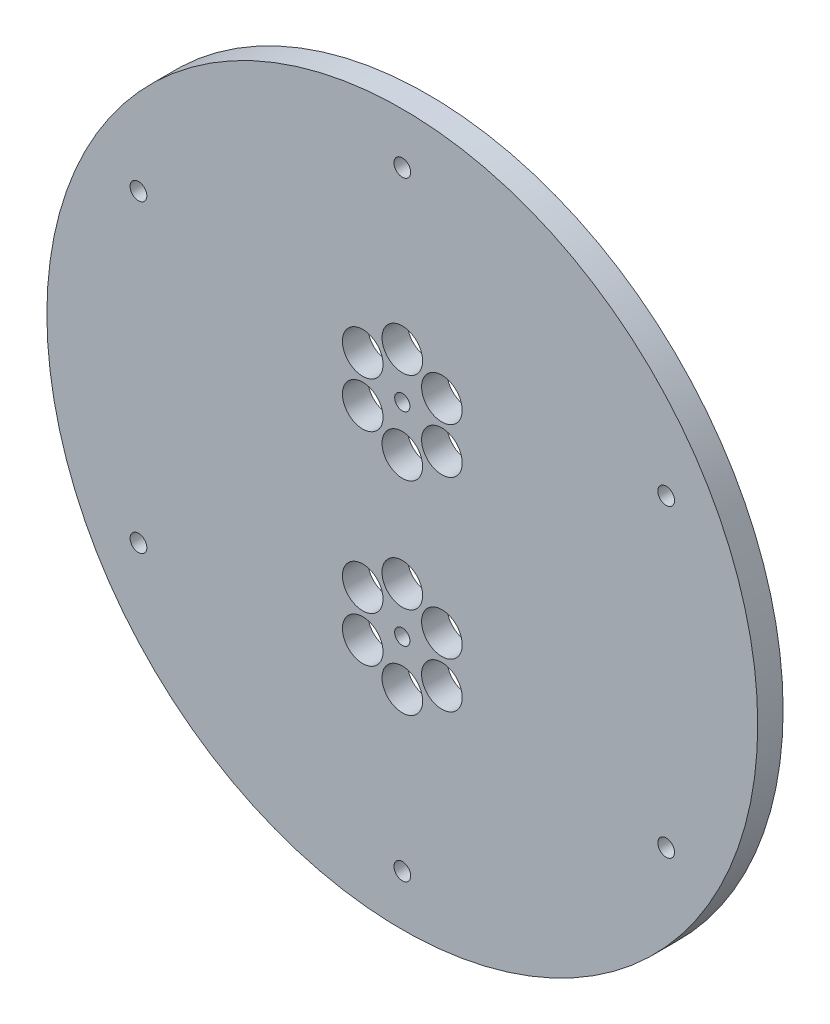
ISO-10303-21;
HEADER;
FILE_DESCRIPTION(('STEP AP214'),'2;1');
FILE_NAME('part.step','',(''),(''),'','','');
FILE_SCHEMA(('AUTOMOTIVE_DESIGN { 1 0 10303 214 1 1 1 1 }'));
ENDSEC;
DATA;
#1=APPLICATION_CONTEXT('core data for automotive mechanical design processes');
#2=APPLICATION_PROTOCOL_DEFINITION('international standard','automotive_design',2000,#1);
#3=PRODUCT_CONTEXT('',#1,'mechanical');
#4=PRODUCT('Part','Part','',(#3));
#5=PRODUCT_RELATED_PRODUCT_CATEGORY('part','',(#4));
#6=PRODUCT_DEFINITION_FORMATION('','',#4);
#7=PRODUCT_DEFINITION_CONTEXT('part definition',#1,'design');
#8=PRODUCT_DEFINITION('design','',#6,#7);
#9=PRODUCT_DEFINITION_SHAPE('','',#8);
#10=(LENGTH_UNIT() NAMED_UNIT(*) SI_UNIT(.MILLI.,.METRE.));
#11=(NAMED_UNIT(*) PLANE_ANGLE_UNIT() SI_UNIT($,.RADIAN.));
#12=(NAMED_UNIT(*) SI_UNIT($,.STERADIAN.) SOLID_ANGLE_UNIT());
#13=UNCERTAINTY_MEASURE_WITH_UNIT(LENGTH_MEASURE(1.E-05),#10,'distance_accuracy_value','');
#14=(GEOMETRIC_REPRESENTATION_CONTEXT(3) GLOBAL_UNCERTAINTY_ASSIGNED_CONTEXT((#13)) GLOBAL_UNIT_ASSIGNED_CONTEXT((#10,
#11,#12)) REPRESENTATION_CONTEXT('',''));
#15=CARTESIAN_POINT('',(0.,0.,0.));
#16=DIRECTION('',(0.,0.,1.));
#17=DIRECTION('',(1.,0.,0.));
#18=AXIS2_PLACEMENT_3D('',#15,#16,#17);
#19=CARTESIAN_POINT('',(0.,0.,5.));
#20=DIRECTION('',(0.,0.,1.));
#21=DIRECTION('',(1.,0.,0.));
#22=AXIS2_PLACEMENT_3D('',#19,#20,#21);
#23=PLANE('',#22);
#24=CARTESIAN_POINT('',(0.,-29.,5.));
#25=DIRECTION('',(0.,0.,1.));
#26=DIRECTION('',(-1.,0.,0.));
#27=AXIS2_PLACEMENT_3D('',#24,#25,#26);
#28=CIRCLE('',#27,4.);
#29=CARTESIAN_POINT('',(-4.,-29.,5.));
#30=VERTEX_POINT('',#29);
#31=EDGE_CURVE('E104',#30,#30,#28,.T.);
#32=ORIENTED_EDGE('',*,*,#31,.F.);
#33=EDGE_LOOP('',(#32));
#34=FACE_BOUND('',#33,.T.);
#35=CARTESIAN_POINT('',(0.,-20.,5.));
#36=DIRECTION('',(0.,0.,1.));
#37=DIRECTION('',(-1.,0.,0.));
#38=AXIS2_PLACEMENT_3D('',#35,#36,#37);
#39=CIRCLE('',#38,1.5);
#40=CARTESIAN_POINT('',(-1.5,-20.,5.));
#41=VERTEX_POINT('',#40);
#42=EDGE_CURVE('E108',#41,#41,#39,.T.);
#43=ORIENTED_EDGE('',*,*,#42,.F.);
#44=EDGE_LOOP('',(#43));
#45=FACE_BOUND('',#44,.T.);
#46=CARTESIAN_POINT('',(0.,-11.,5.));
#47=DIRECTION('',(0.,0.,1.));
#48=DIRECTION('',(-1.,0.,0.));
#49=AXIS2_PLACEMENT_3D('',#46,#47,#48);
#50=CIRCLE('',#49,4.);
#51=CARTESIAN_POINT('',(-3.99999999999999,-11.,5.));
#52=VERTEX_POINT('',#51);
#53=EDGE_CURVE('E112',#52,#52,#50,.T.);
#54=ORIENTED_EDGE('',*,*,#53,.F.);
#55=EDGE_LOOP('',(#54));
#56=FACE_BOUND('',#55,.T.);
#57=CARTESIAN_POINT('',(-7.79422863405994,24.5,5.));
#58=DIRECTION('',(0.,0.,1.));
#59=DIRECTION('',(1.,0.,0.));
#60=AXIS2_PLACEMENT_3D('',#57,#58,#59);
#61=CIRCLE('',#60,4.);
#62=CARTESIAN_POINT('',(-3.79422863405994,24.5,5.));
#63=VERTEX_POINT('',#62);
#64=EDGE_CURVE('E116',#63,#63,#61,.T.);
#65=ORIENTED_EDGE('',*,*,#64,.F.);
#66=EDGE_LOOP('',(#65));
#67=FACE_BOUND('',#66,.T.);
#68=CARTESIAN_POINT('',(0.,11.,5.));
#69=DIRECTION('',(0.,0.,1.));
#70=DIRECTION('',(1.,0.,0.));
#71=AXIS2_PLACEMENT_3D('',#68,#69,#70);
#72=CIRCLE('',#71,4.);
#73=CARTESIAN_POINT('',(4.00000000000001,11.,5.));
#74=VERTEX_POINT('',#73);
#75=EDGE_CURVE('E120',#74,#74,#72,.T.);
#76=ORIENTED_EDGE('',*,*,#75,.F.);
#77=EDGE_LOOP('',(#76));
#78=FACE_BOUND('',#77,.T.);
#79=CARTESIAN_POINT('',(7.79422863405995,24.5,5.));
#80=DIRECTION('',(0.,0.,1.));
#81=DIRECTION('',(1.,0.,0.));
#82=AXIS2_PLACEMENT_3D('',#79,#80,#81);
#83=CIRCLE('',#82,4.);
#84=CARTESIAN_POINT('',(11.79422863406,24.5,5.));
#85=VERTEX_POINT('',#84);
#86=EDGE_CURVE('E124',#85,#85,#83,.T.);
#87=ORIENTED_EDGE('',*,*,#86,.F.);
#88=EDGE_LOOP('',(#87));
#89=FACE_BOUND('',#88,.T.);
#90=CARTESIAN_POINT('',(0.,29.,5.));
#91=DIRECTION('',(0.,0.,1.));
#92=DIRECTION('',(1.,0.,0.));
#93=AXIS2_PLACEMENT_3D('',#90,#91,#92);
#94=CIRCLE('',#93,4.);
#95=CARTESIAN_POINT('',(4.,29.,5.));
#96=VERTEX_POINT('',#95);
#97=EDGE_CURVE('E128',#96,#96,#94,.T.);
#98=ORIENTED_EDGE('',*,*,#97,.F.);
#99=EDGE_LOOP('',(#98));
#100=FACE_BOUND('',#99,.T.);
#101=CARTESIAN_POINT('',(-51.9615242270663,-30.,5.));
#102=DIRECTION('',(0.,0.,1.));
#103=DIRECTION('',(1.,0.,0.));
#104=AXIS2_PLACEMENT_3D('',#101,#102,#103);
#105=CIRCLE('',#104,1.65);
#106=CARTESIAN_POINT('',(-50.3115242270663,-30.,5.));
#107=VERTEX_POINT('',#106);
#108=EDGE_CURVE('E132',#107,#107,#105,.T.);
#109=ORIENTED_EDGE('',*,*,#108,.F.);
#110=EDGE_LOOP('',(#109));
#111=FACE_BOUND('',#110,.T.);
#112=CARTESIAN_POINT('',(51.9615242270663,-30.,5.));
#113=DIRECTION('',(0.,0.,1.));
#114=DIRECTION('',(1.,0.,0.));
#115=AXIS2_PLACEMENT_3D('',#112,#113,#114);
#116=CIRCLE('',#115,1.65000000000015);
#117=CARTESIAN_POINT('',(53.6115242270665,-30.,5.));
#118=VERTEX_POINT('',#117);
#119=EDGE_CURVE('E70',#118,#118,#116,.T.);
#120=ORIENTED_EDGE('',*,*,#119,.F.);
#121=EDGE_LOOP('',(#120));
#122=FACE_BOUND('',#121,.T.);
#123=CARTESIAN_POINT('',(0.,60.,5.));
#124=DIRECTION('',(0.,0.,1.));
#125=DIRECTION('',(1.,0.,0.));
#126=AXIS2_PLACEMENT_3D('',#123,#124,#125);
#127=CIRCLE('',#126,1.65);
#128=CARTESIAN_POINT('',(1.65,60.,5.));
#129=VERTEX_POINT('',#128);
#130=EDGE_CURVE('E48',#129,#129,#127,.T.);
#131=ORIENTED_EDGE('',*,*,#130,.F.);
#132=EDGE_LOOP('',(#131));
#133=FACE_BOUND('',#132,.T.);
#134=CARTESIAN_POINT('',(0.,0.,5.));
#135=DIRECTION('',(0.,0.,1.));
#136=DIRECTION('',(1.,0.,0.));
#137=AXIS2_PLACEMENT_3D('',#134,#135,#136);
#138=CIRCLE('',#137,70.);
#139=CARTESIAN_POINT('',(70.,0.,5.));
#140=VERTEX_POINT('',#139);
#141=EDGE_CURVE('E11',#140,#140,#138,.T.);
#142=ORIENTED_EDGE('',*,*,#141,.T.);
#143=EDGE_LOOP('',(#142));
#144=FACE_BOUND('',#143,.T.);
#145=CARTESIAN_POINT('',(51.9615242270663,30.,5.));
#146=DIRECTION('',(0.,0.,1.));
#147=DIRECTION('',(1.,0.,0.));
#148=AXIS2_PLACEMENT_3D('',#145,#146,#147);
#149=CIRCLE('',#148,1.65000000000008);
#150=CARTESIAN_POINT('',(53.6115242270664,30.,5.));
#151=VERTEX_POINT('',#150);
#152=EDGE_CURVE('E61',#151,#151,#149,.T.);
#153=ORIENTED_EDGE('',*,*,#152,.F.);
#154=EDGE_LOOP('',(#153));
#155=FACE_BOUND('',#154,.T.);
#156=CARTESIAN_POINT('',(0.,-60.,5.));
#157=DIRECTION('',(0.,0.,1.));
#158=DIRECTION('',(1.,0.,0.));
#159=AXIS2_PLACEMENT_3D('',#156,#157,#158);
#160=CIRCLE('',#159,1.65);
#161=CARTESIAN_POINT('',(1.65000000000001,-60.,5.));
#162=VERTEX_POINT('',#161);
#163=EDGE_CURVE('E142',#162,#162,#160,.T.);
#164=ORIENTED_EDGE('',*,*,#163,.F.);
#165=EDGE_LOOP('',(#164));
#166=FACE_BOUND('',#165,.T.);
#167=CARTESIAN_POINT('',(-51.9615242270663,30.,5.));
#168=DIRECTION('',(0.,0.,1.));
#169=DIRECTION('',(1.,0.,0.));
#170=AXIS2_PLACEMENT_3D('',#167,#168,#169);
#171=CIRCLE('',#170,1.65);
#172=CARTESIAN_POINT('',(-50.3115242270664,30.,5.));
#173=VERTEX_POINT('',#172);
#174=EDGE_CURVE('E146',#173,#173,#171,.T.);
#175=ORIENTED_EDGE('',*,*,#174,.F.);
#176=EDGE_LOOP('',(#175));
#177=FACE_BOUND('',#176,.T.);
#178=CARTESIAN_POINT('',(0.,20.,5.));
#179=DIRECTION('',(0.,0.,1.));
#180=DIRECTION('',(1.,0.,0.));
#181=AXIS2_PLACEMENT_3D('',#178,#179,#180);
#182=CIRCLE('',#181,1.5);
#183=CARTESIAN_POINT('',(1.5,20.,5.));
#184=VERTEX_POINT('',#183);
#185=EDGE_CURVE('E150',#184,#184,#182,.T.);
#186=ORIENTED_EDGE('',*,*,#185,.F.);
#187=EDGE_LOOP('',(#186));
#188=FACE_BOUND('',#187,.T.);
#189=CARTESIAN_POINT('',(7.79422863405995,15.5,5.));
#190=DIRECTION('',(0.,0.,1.));
#191=DIRECTION('',(1.,0.,0.));
#192=AXIS2_PLACEMENT_3D('',#189,#190,#191);
#193=CIRCLE('',#192,4.);
#194=CARTESIAN_POINT('',(11.79422863406,15.5,5.));
#195=VERTEX_POINT('',#194);
#196=EDGE_CURVE('E154',#195,#195,#193,.T.);
#197=ORIENTED_EDGE('',*,*,#196,.F.);
#198=EDGE_LOOP('',(#197));
#199=FACE_BOUND('',#198,.T.);
#200=CARTESIAN_POINT('',(-7.79422863405994,15.5,5.));
#201=DIRECTION('',(0.,0.,1.));
#202=DIRECTION('',(1.,0.,0.));
#203=AXIS2_PLACEMENT_3D('',#200,#201,#202);
#204=CIRCLE('',#203,4.);
#205=CARTESIAN_POINT('',(-3.79422863405994,15.5,5.));
#206=VERTEX_POINT('',#205);
#207=EDGE_CURVE('E158',#206,#206,#204,.T.);
#208=ORIENTED_EDGE('',*,*,#207,.F.);
#209=EDGE_LOOP('',(#208));
#210=FACE_BOUND('',#209,.T.);
#211=CARTESIAN_POINT('',(7.79422863405995,-15.5,5.));
#212=DIRECTION('',(0.,0.,1.));
#213=DIRECTION('',(-1.,0.,0.));
#214=AXIS2_PLACEMENT_3D('',#211,#212,#213);
#215=CIRCLE('',#214,4.);
#216=CARTESIAN_POINT('',(3.79422863405995,-15.5,5.));
#217=VERTEX_POINT('',#216);
#218=EDGE_CURVE('E162',#217,#217,#215,.T.);
#219=ORIENTED_EDGE('',*,*,#218,.F.);
#220=EDGE_LOOP('',(#219));
#221=FACE_BOUND('',#220,.T.);
#222=CARTESIAN_POINT('',(-7.79422863405994,-15.5,5.));
#223=DIRECTION('',(0.,0.,1.));
#224=DIRECTION('',(-1.,0.,0.));
#225=AXIS2_PLACEMENT_3D('',#222,#223,#224);
#226=CIRCLE('',#225,4.);
#227=CARTESIAN_POINT('',(-11.7942286340599,-15.5,5.));
#228=VERTEX_POINT('',#227);
#229=EDGE_CURVE('E166',#228,#228,#226,.T.);
#230=ORIENTED_EDGE('',*,*,#229,.F.);
#231=EDGE_LOOP('',(#230));
#232=FACE_BOUND('',#231,.T.);
#233=CARTESIAN_POINT('',(-7.79422863405994,-24.5,5.));
#234=DIRECTION('',(0.,0.,1.));
#235=DIRECTION('',(-1.,0.,0.));
#236=AXIS2_PLACEMENT_3D('',#233,#234,#235);
#237=CIRCLE('',#236,4.);
#238=CARTESIAN_POINT('',(-11.7942286340599,-24.5,5.));
#239=VERTEX_POINT('',#238);
#240=EDGE_CURVE('E170',#239,#239,#237,.T.);
#241=ORIENTED_EDGE('',*,*,#240,.F.);
#242=EDGE_LOOP('',(#241));
#243=FACE_BOUND('',#242,.T.);
#244=CARTESIAN_POINT('',(7.79422863405995,-24.5,5.));
#245=DIRECTION('',(0.,0.,1.));
#246=DIRECTION('',(-1.,0.,0.));
#247=AXIS2_PLACEMENT_3D('',#244,#245,#246);
#248=CIRCLE('',#247,4.);
#249=CARTESIAN_POINT('',(3.79422863405995,-24.5,5.));
#250=VERTEX_POINT('',#249);
#251=EDGE_CURVE('E173',#250,#250,#248,.T.);
#252=ORIENTED_EDGE('',*,*,#251,.F.);
#253=EDGE_LOOP('',(#252));
#254=FACE_BOUND('',#253,.T.);
#255=ADVANCED_FACE('F34',(#34,#45,#56,#67,#78,#89,#100,#111,#122,#133,#144,#155,#166,#177,#188,
#199,#210,#221,#232,#243,#254),#23,.T.);
#256=CARTESIAN_POINT('',(0.,0.,0.));
#257=DIRECTION('',(0.,0.,1.));
#258=DIRECTION('',(1.,0.,0.));
#259=AXIS2_PLACEMENT_3D('',#256,#257,#258);
#260=PLANE('',#259);
#261=CARTESIAN_POINT('',(0.,0.,0.));
#262=DIRECTION('',(0.,0.,1.));
#263=DIRECTION('',(1.,0.,0.));
#264=AXIS2_PLACEMENT_3D('',#261,#262,#263);
#265=CIRCLE('',#264,70.);
#266=CARTESIAN_POINT('',(70.,0.,0.));
#267=VERTEX_POINT('',#266);
#268=EDGE_CURVE('E38',#267,#267,#265,.T.);
#269=ORIENTED_EDGE('',*,*,#268,.F.);
#270=EDGE_LOOP('',(#269));
#271=FACE_BOUND('',#270,.T.);
#272=CARTESIAN_POINT('',(0.,60.,0.));
#273=DIRECTION('',(0.,0.,1.));
#274=DIRECTION('',(1.,0.,0.));
#275=AXIS2_PLACEMENT_3D('',#272,#273,#274);
#276=CIRCLE('',#275,1.65);
#277=CARTESIAN_POINT('',(1.65,60.,0.));
#278=VERTEX_POINT('',#277);
#279=EDGE_CURVE('E51',#278,#278,#276,.T.);
#280=ORIENTED_EDGE('',*,*,#279,.T.);
#281=EDGE_LOOP('',(#280));
#282=FACE_BOUND('',#281,.T.);
#283=CARTESIAN_POINT('',(51.9615242270663,30.,0.));
#284=DIRECTION('',(0.,0.,1.));
#285=DIRECTION('',(1.,0.,0.));
#286=AXIS2_PLACEMENT_3D('',#283,#284,#285);
#287=CIRCLE('',#286,1.65000000000008);
#288=CARTESIAN_POINT('',(53.6115242270664,30.,0.));
#289=VERTEX_POINT('',#288);
#290=EDGE_CURVE('E66',#289,#289,#287,.T.);
#291=ORIENTED_EDGE('',*,*,#290,.T.);
#292=EDGE_LOOP('',(#291));
#293=FACE_BOUND('',#292,.T.);
#294=CARTESIAN_POINT('',(51.9615242270663,-30.,0.));
#295=DIRECTION('',(0.,0.,1.));
#296=DIRECTION('',(1.,0.,0.));
#297=AXIS2_PLACEMENT_3D('',#294,#295,#296);
#298=CIRCLE('',#297,1.65000000000015);
#299=CARTESIAN_POINT('',(53.6115242270665,-30.,0.));
#300=VERTEX_POINT('',#299);
#301=EDGE_CURVE('E67',#300,#300,#298,.T.);
#302=ORIENTED_EDGE('',*,*,#301,.T.);
#303=EDGE_LOOP('',(#302));
#304=FACE_BOUND('',#303,.T.);
#305=CARTESIAN_POINT('',(0.,-60.,0.));
#306=DIRECTION('',(0.,0.,1.));
#307=DIRECTION('',(1.,0.,0.));
#308=AXIS2_PLACEMENT_3D('',#305,#306,#307);
#309=CIRCLE('',#308,1.65);
#310=CARTESIAN_POINT('',(1.65000000000001,-60.,0.));
#311=VERTEX_POINT('',#310);
#312=EDGE_CURVE('E295',#311,#311,#309,.T.);
#313=ORIENTED_EDGE('',*,*,#312,.T.);
#314=EDGE_LOOP('',(#313));
#315=FACE_BOUND('',#314,.T.);
#316=CARTESIAN_POINT('',(-51.9615242270663,-30.,0.));
#317=DIRECTION('',(0.,0.,1.));
#318=DIRECTION('',(1.,0.,0.));
#319=AXIS2_PLACEMENT_3D('',#316,#317,#318);
#320=CIRCLE('',#319,1.65);
#321=CARTESIAN_POINT('',(-50.3115242270663,-30.,0.));
#322=VERTEX_POINT('',#321);
#323=EDGE_CURVE('E301',#322,#322,#320,.T.);
#324=ORIENTED_EDGE('',*,*,#323,.T.);
#325=EDGE_LOOP('',(#324));
#326=FACE_BOUND('',#325,.T.);
#327=CARTESIAN_POINT('',(-51.9615242270663,30.,0.));
#328=DIRECTION('',(0.,0.,1.));
#329=DIRECTION('',(1.,0.,0.));
#330=AXIS2_PLACEMENT_3D('',#327,#328,#329);
#331=CIRCLE('',#330,1.65);
#332=CARTESIAN_POINT('',(-50.3115242270664,30.,0.));
#333=VERTEX_POINT('',#332);
#334=EDGE_CURVE('E311',#333,#333,#331,.T.);
#335=ORIENTED_EDGE('',*,*,#334,.T.);
#336=EDGE_LOOP('',(#335));
#337=FACE_BOUND('',#336,.T.);
#338=CARTESIAN_POINT('',(0.,29.,0.));
#339=DIRECTION('',(0.,0.,1.));
#340=DIRECTION('',(1.,0.,0.));
#341=AXIS2_PLACEMENT_3D('',#338,#339,#340);
#342=CIRCLE('',#341,4.);
#343=CARTESIAN_POINT('',(4.,29.,0.));
#344=VERTEX_POINT('',#343);
#345=EDGE_CURVE('E316',#344,#344,#342,.T.);
#346=ORIENTED_EDGE('',*,*,#345,.T.);
#347=EDGE_LOOP('',(#346));
#348=FACE_BOUND('',#347,.T.);
#349=CARTESIAN_POINT('',(0.,20.,0.));
#350=DIRECTION('',(0.,0.,1.));
#351=DIRECTION('',(1.,0.,0.));
#352=AXIS2_PLACEMENT_3D('',#349,#350,#351);
#353=CIRCLE('',#352,1.5);
#354=CARTESIAN_POINT('',(1.5,20.,0.));
#355=VERTEX_POINT('',#354);
#356=EDGE_CURVE('E325',#355,#355,#353,.T.);
#357=ORIENTED_EDGE('',*,*,#356,.T.);
#358=EDGE_LOOP('',(#357));
#359=FACE_BOUND('',#358,.T.);
#360=CARTESIAN_POINT('',(7.79422863405995,24.5,0.));
#361=DIRECTION('',(0.,0.,1.));
#362=DIRECTION('',(1.,0.,0.));
#363=AXIS2_PLACEMENT_3D('',#360,#361,#362);
#364=CIRCLE('',#363,4.);
#365=CARTESIAN_POINT('',(11.79422863406,24.5,0.));
#366=VERTEX_POINT('',#365);
#367=EDGE_CURVE('E326',#366,#366,#364,.T.);
#368=ORIENTED_EDGE('',*,*,#367,.T.);
#369=EDGE_LOOP('',(#368));
#370=FACE_BOUND('',#369,.T.);
#371=CARTESIAN_POINT('',(7.79422863405995,15.5,0.));
#372=DIRECTION('',(0.,0.,1.));
#373=DIRECTION('',(1.,0.,0.));
#374=AXIS2_PLACEMENT_3D('',#371,#372,#373);
#375=CIRCLE('',#374,4.);
#376=CARTESIAN_POINT('',(11.79422863406,15.5,0.));
#377=VERTEX_POINT('',#376);
#378=EDGE_CURVE('E345',#377,#377,#375,.T.);
#379=ORIENTED_EDGE('',*,*,#378,.T.);
#380=EDGE_LOOP('',(#379));
#381=FACE_BOUND('',#380,.T.);
#382=CARTESIAN_POINT('',(0.,11.,0.));
#383=DIRECTION('',(0.,0.,1.));
#384=DIRECTION('',(1.,0.,0.));
#385=AXIS2_PLACEMENT_3D('',#382,#383,#384);
#386=CIRCLE('',#385,4.);
#387=CARTESIAN_POINT('',(4.00000000000001,11.,0.));
#388=VERTEX_POINT('',#387);
#389=EDGE_CURVE('E349',#388,#388,#386,.T.);
#390=ORIENTED_EDGE('',*,*,#389,.T.);
#391=EDGE_LOOP('',(#390));
#392=FACE_BOUND('',#391,.T.);
#393=CARTESIAN_POINT('',(-7.79422863405994,15.5,0.));
#394=DIRECTION('',(0.,0.,1.));
#395=DIRECTION('',(1.,0.,0.));
#396=AXIS2_PLACEMENT_3D('',#393,#394,#395);
#397=CIRCLE('',#396,4.);
#398=CARTESIAN_POINT('',(-3.79422863405994,15.5,0.));
#399=VERTEX_POINT('',#398);
#400=EDGE_CURVE('E353',#399,#399,#397,.T.);
#401=ORIENTED_EDGE('',*,*,#400,.T.);
#402=EDGE_LOOP('',(#401));
#403=FACE_BOUND('',#402,.T.);
#404=CARTESIAN_POINT('',(-7.79422863405994,24.5,0.));
#405=DIRECTION('',(0.,0.,1.));
#406=DIRECTION('',(1.,0.,0.));
#407=AXIS2_PLACEMENT_3D('',#404,#405,#406);
#408=CIRCLE('',#407,4.);
#409=CARTESIAN_POINT('',(-3.79422863405994,24.5,0.));
#410=VERTEX_POINT('',#409);
#411=EDGE_CURVE('E357',#410,#410,#408,.T.);
#412=ORIENTED_EDGE('',*,*,#411,.T.);
#413=EDGE_LOOP('',(#412));
#414=FACE_BOUND('',#413,.T.);
#415=CARTESIAN_POINT('',(7.79422863405995,-15.5,0.));
#416=DIRECTION('',(0.,0.,1.));
#417=DIRECTION('',(-1.,0.,0.));
#418=AXIS2_PLACEMENT_3D('',#415,#416,#417);
#419=CIRCLE('',#418,4.);
#420=CARTESIAN_POINT('',(3.79422863405995,-15.5,0.));
#421=VERTEX_POINT('',#420);
#422=EDGE_CURVE('E361',#421,#421,#419,.T.);
#423=ORIENTED_EDGE('',*,*,#422,.T.);
#424=EDGE_LOOP('',(#423));
#425=FACE_BOUND('',#424,.T.);
#426=CARTESIAN_POINT('',(0.,-11.,0.));
#427=DIRECTION('',(0.,0.,1.));
#428=DIRECTION('',(-1.,0.,0.));
#429=AXIS2_PLACEMENT_3D('',#426,#427,#428);
#430=CIRCLE('',#429,4.);
#431=CARTESIAN_POINT('',(-3.99999999999999,-11.,0.));
#432=VERTEX_POINT('',#431);
#433=EDGE_CURVE('E206',#432,#432,#430,.T.);
#434=ORIENTED_EDGE('',*,*,#433,.T.);
#435=EDGE_LOOP('',(#434));
#436=FACE_BOUND('',#435,.T.);
#437=CARTESIAN_POINT('',(-7.79422863405994,-15.5,0.));
#438=DIRECTION('',(0.,0.,1.));
#439=DIRECTION('',(-1.,0.,0.));
#440=AXIS2_PLACEMENT_3D('',#437,#438,#439);
#441=CIRCLE('',#440,4.);
#442=CARTESIAN_POINT('',(-11.7942286340599,-15.5,0.));
#443=VERTEX_POINT('',#442);
#444=EDGE_CURVE('E199',#443,#443,#441,.T.);
#445=ORIENTED_EDGE('',*,*,#444,.T.);
#446=EDGE_LOOP('',(#445));
#447=FACE_BOUND('',#446,.T.);
#448=CARTESIAN_POINT('',(0.,-20.,0.));
#449=DIRECTION('',(0.,0.,1.));
#450=DIRECTION('',(-1.,0.,0.));
#451=AXIS2_PLACEMENT_3D('',#448,#449,#450);
#452=CIRCLE('',#451,1.5);
#453=CARTESIAN_POINT('',(-1.5,-20.,0.));
#454=VERTEX_POINT('',#453);
#455=EDGE_CURVE('E200',#454,#454,#452,.T.);
#456=ORIENTED_EDGE('',*,*,#455,.T.);
#457=EDGE_LOOP('',(#456));
#458=FACE_BOUND('',#457,.T.);
#459=CARTESIAN_POINT('',(-7.79422863405994,-24.5,0.));
#460=DIRECTION('',(0.,0.,1.));
#461=DIRECTION('',(-1.,0.,0.));
#462=AXIS2_PLACEMENT_3D('',#459,#460,#461);
#463=CIRCLE('',#462,4.);
#464=CARTESIAN_POINT('',(-11.7942286340599,-24.5,0.));
#465=VERTEX_POINT('',#464);
#466=EDGE_CURVE('E187',#465,#465,#463,.T.);
#467=ORIENTED_EDGE('',*,*,#466,.T.);
#468=EDGE_LOOP('',(#467));
#469=FACE_BOUND('',#468,.T.);
#470=CARTESIAN_POINT('',(0.,-29.,0.));
#471=DIRECTION('',(0.,0.,1.));
#472=DIRECTION('',(-1.,0.,0.));
#473=AXIS2_PLACEMENT_3D('',#470,#471,#472);
#474=CIRCLE('',#473,4.);
#475=CARTESIAN_POINT('',(-4.,-29.,0.));
#476=VERTEX_POINT('',#475);
#477=EDGE_CURVE('E176',#476,#476,#474,.T.);
#478=ORIENTED_EDGE('',*,*,#477,.T.);
#479=EDGE_LOOP('',(#478));
#480=FACE_BOUND('',#479,.T.);
#481=CARTESIAN_POINT('',(7.79422863405995,-24.5,0.));
#482=DIRECTION('',(0.,0.,1.));
#483=DIRECTION('',(-1.,0.,0.));
#484=AXIS2_PLACEMENT_3D('',#481,#482,#483);
#485=CIRCLE('',#484,4.);
#486=CARTESIAN_POINT('',(3.79422863405995,-24.5,0.));
#487=VERTEX_POINT('',#486);
#488=EDGE_CURVE('E177',#487,#487,#485,.T.);
#489=ORIENTED_EDGE('',*,*,#488,.T.);
#490=EDGE_LOOP('',(#489));
#491=FACE_BOUND('',#490,.T.);
#492=ADVANCED_FACE('F79',(#271,#282,#293,#304,#315,#326,#337,#348,#359,#370,#381,#392,#403,#414,
#425,#436,#447,#458,#469,#480,#491),#260,.F.);
#493=CARTESIAN_POINT('',(0.,0.,5.));
#494=DIRECTION('',(0.,0.,-1.));
#495=DIRECTION('',(-1.,0.,0.));
#496=AXIS2_PLACEMENT_3D('',#493,#494,#495);
#497=CYLINDRICAL_SURFACE('',#496,70.);
#498=ORIENTED_EDGE('',*,*,#141,.F.);
#499=EDGE_LOOP('',(#498));
#500=FACE_BOUND('',#499,.T.);
#501=ORIENTED_EDGE('',*,*,#268,.T.);
#502=EDGE_LOOP('',(#501));
#503=FACE_BOUND('',#502,.T.);
#504=ADVANCED_FACE('F36',(#500,#503),#497,.T.);
#505=CARTESIAN_POINT('',(0.,60.,5.));
#506=DIRECTION('',(0.,0.,-1.));
#507=DIRECTION('',(-1.,0.,0.));
#508=AXIS2_PLACEMENT_3D('',#505,#506,#507);
#509=CYLINDRICAL_SURFACE('',#508,1.65);
#510=ORIENTED_EDGE('',*,*,#130,.T.);
#511=EDGE_LOOP('',(#510));
#512=FACE_BOUND('',#511,.T.);
#513=ORIENTED_EDGE('',*,*,#279,.F.);
#514=EDGE_LOOP('',(#513));
#515=FACE_BOUND('',#514,.T.);
#516=ADVANCED_FACE('F82',(#512,#515),#509,.F.);
#517=CARTESIAN_POINT('',(51.9615242270663,30.,5.));
#518=DIRECTION('',(0.,0.,-1.));
#519=DIRECTION('',(-1.,0.,0.));
#520=AXIS2_PLACEMENT_3D('',#517,#518,#519);
#521=CYLINDRICAL_SURFACE('',#520,1.65000000000008);
#522=ORIENTED_EDGE('',*,*,#152,.T.);
#523=EDGE_LOOP('',(#522));
#524=FACE_BOUND('',#523,.T.);
#525=ORIENTED_EDGE('',*,*,#290,.F.);
#526=EDGE_LOOP('',(#525));
#527=FACE_BOUND('',#526,.T.);
#528=ADVANCED_FACE('F84',(#524,#527),#521,.F.);
#529=CARTESIAN_POINT('',(51.9615242270663,-30.,5.));
#530=DIRECTION('',(0.,0.,-1.));
#531=DIRECTION('',(-1.,0.,0.));
#532=AXIS2_PLACEMENT_3D('',#529,#530,#531);
#533=CYLINDRICAL_SURFACE('',#532,1.65000000000015);
#534=ORIENTED_EDGE('',*,*,#119,.T.);
#535=EDGE_LOOP('',(#534));
#536=FACE_BOUND('',#535,.T.);
#537=ORIENTED_EDGE('',*,*,#301,.F.);
#538=EDGE_LOOP('',(#537));
#539=FACE_BOUND('',#538,.T.);
#540=ADVANCED_FACE('F90',(#536,#539),#533,.F.);
#541=CARTESIAN_POINT('',(0.,-60.,5.));
#542=DIRECTION('',(0.,0.,-1.));
#543=DIRECTION('',(-1.,0.,0.));
#544=AXIS2_PLACEMENT_3D('',#541,#542,#543);
#545=CYLINDRICAL_SURFACE('',#544,1.65);
#546=ORIENTED_EDGE('',*,*,#163,.T.);
#547=EDGE_LOOP('',(#546));
#548=FACE_BOUND('',#547,.T.);
#549=ORIENTED_EDGE('',*,*,#312,.F.);
#550=EDGE_LOOP('',(#549));
#551=FACE_BOUND('',#550,.T.);
#552=ADVANCED_FACE('F281',(#548,#551),#545,.F.);
#553=CARTESIAN_POINT('',(-51.9615242270663,-30.,5.));
#554=DIRECTION('',(0.,0.,-1.));
#555=DIRECTION('',(-1.,0.,0.));
#556=AXIS2_PLACEMENT_3D('',#553,#554,#555);
#557=CYLINDRICAL_SURFACE('',#556,1.65);
#558=ORIENTED_EDGE('',*,*,#108,.T.);
#559=EDGE_LOOP('',(#558));
#560=FACE_BOUND('',#559,.T.);
#561=ORIENTED_EDGE('',*,*,#323,.F.);
#562=EDGE_LOOP('',(#561));
#563=FACE_BOUND('',#562,.T.);
#564=ADVANCED_FACE('F277',(#560,#563),#557,.F.);
#565=CARTESIAN_POINT('',(-51.9615242270663,30.,5.));
#566=DIRECTION('',(0.,0.,-1.));
#567=DIRECTION('',(-1.,0.,0.));
#568=AXIS2_PLACEMENT_3D('',#565,#566,#567);
#569=CYLINDRICAL_SURFACE('',#568,1.65);
#570=ORIENTED_EDGE('',*,*,#174,.T.);
#571=EDGE_LOOP('',(#570));
#572=FACE_BOUND('',#571,.T.);
#573=ORIENTED_EDGE('',*,*,#334,.F.);
#574=EDGE_LOOP('',(#573));
#575=FACE_BOUND('',#574,.T.);
#576=ADVANCED_FACE('F273',(#572,#575),#569,.F.);
#577=CARTESIAN_POINT('',(0.,29.,5.));
#578=DIRECTION('',(0.,0.,-1.));
#579=DIRECTION('',(-1.,0.,0.));
#580=AXIS2_PLACEMENT_3D('',#577,#578,#579);
#581=CYLINDRICAL_SURFACE('',#580,4.);
#582=ORIENTED_EDGE('',*,*,#97,.T.);
#583=EDGE_LOOP('',(#582));
#584=FACE_BOUND('',#583,.T.);
#585=ORIENTED_EDGE('',*,*,#345,.F.);
#586=EDGE_LOOP('',(#585));
#587=FACE_BOUND('',#586,.T.);
#588=ADVANCED_FACE('F269',(#584,#587),#581,.F.);
#589=CARTESIAN_POINT('',(0.,20.,5.));
#590=DIRECTION('',(0.,0.,-1.));
#591=DIRECTION('',(-1.,0.,0.));
#592=AXIS2_PLACEMENT_3D('',#589,#590,#591);
#593=CYLINDRICAL_SURFACE('',#592,1.5);
#594=ORIENTED_EDGE('',*,*,#185,.T.);
#595=EDGE_LOOP('',(#594));
#596=FACE_BOUND('',#595,.T.);
#597=ORIENTED_EDGE('',*,*,#356,.F.);
#598=EDGE_LOOP('',(#597));
#599=FACE_BOUND('',#598,.T.);
#600=ADVANCED_FACE('F265',(#596,#599),#593,.F.);
#601=CARTESIAN_POINT('',(7.79422863405995,24.5,5.));
#602=DIRECTION('',(0.,0.,-1.));
#603=DIRECTION('',(-1.,0.,0.));
#604=AXIS2_PLACEMENT_3D('',#601,#602,#603);
#605=CYLINDRICAL_SURFACE('',#604,4.);
#606=ORIENTED_EDGE('',*,*,#86,.T.);
#607=EDGE_LOOP('',(#606));
#608=FACE_BOUND('',#607,.T.);
#609=ORIENTED_EDGE('',*,*,#367,.F.);
#610=EDGE_LOOP('',(#609));
#611=FACE_BOUND('',#610,.T.);
#612=ADVANCED_FACE('F261',(#608,#611),#605,.F.);
#613=CARTESIAN_POINT('',(7.79422863405995,15.5,5.));
#614=DIRECTION('',(0.,0.,-1.));
#615=DIRECTION('',(-1.,0.,0.));
#616=AXIS2_PLACEMENT_3D('',#613,#614,#615);
#617=CYLINDRICAL_SURFACE('',#616,4.);
#618=ORIENTED_EDGE('',*,*,#196,.T.);
#619=EDGE_LOOP('',(#618));
#620=FACE_BOUND('',#619,.T.);
#621=ORIENTED_EDGE('',*,*,#378,.F.);
#622=EDGE_LOOP('',(#621));
#623=FACE_BOUND('',#622,.T.);
#624=ADVANCED_FACE('F257',(#620,#623),#617,.F.);
#625=CARTESIAN_POINT('',(0.,11.,5.));
#626=DIRECTION('',(0.,0.,-1.));
#627=DIRECTION('',(-1.,0.,0.));
#628=AXIS2_PLACEMENT_3D('',#625,#626,#627);
#629=CYLINDRICAL_SURFACE('',#628,4.);
#630=ORIENTED_EDGE('',*,*,#75,.T.);
#631=EDGE_LOOP('',(#630));
#632=FACE_BOUND('',#631,.T.);
#633=ORIENTED_EDGE('',*,*,#389,.F.);
#634=EDGE_LOOP('',(#633));
#635=FACE_BOUND('',#634,.T.);
#636=ADVANCED_FACE('F253',(#632,#635),#629,.F.);
#637=CARTESIAN_POINT('',(-7.79422863405994,15.5,5.));
#638=DIRECTION('',(0.,0.,-1.));
#639=DIRECTION('',(-1.,0.,0.));
#640=AXIS2_PLACEMENT_3D('',#637,#638,#639);
#641=CYLINDRICAL_SURFACE('',#640,4.);
#642=ORIENTED_EDGE('',*,*,#207,.T.);
#643=EDGE_LOOP('',(#642));
#644=FACE_BOUND('',#643,.T.);
#645=ORIENTED_EDGE('',*,*,#400,.F.);
#646=EDGE_LOOP('',(#645));
#647=FACE_BOUND('',#646,.T.);
#648=ADVANCED_FACE('F249',(#644,#647),#641,.F.);
#649=CARTESIAN_POINT('',(-7.79422863405994,24.5,5.));
#650=DIRECTION('',(0.,0.,-1.));
#651=DIRECTION('',(-1.,0.,0.));
#652=AXIS2_PLACEMENT_3D('',#649,#650,#651);
#653=CYLINDRICAL_SURFACE('',#652,4.);
#654=ORIENTED_EDGE('',*,*,#64,.T.);
#655=EDGE_LOOP('',(#654));
#656=FACE_BOUND('',#655,.T.);
#657=ORIENTED_EDGE('',*,*,#411,.F.);
#658=EDGE_LOOP('',(#657));
#659=FACE_BOUND('',#658,.T.);
#660=ADVANCED_FACE('F245',(#656,#659),#653,.F.);
#661=CARTESIAN_POINT('',(7.79422863405995,-15.5,5.));
#662=DIRECTION('',(0.,0.,-1.));
#663=DIRECTION('',(-1.,0.,0.));
#664=AXIS2_PLACEMENT_3D('',#661,#662,#663);
#665=CYLINDRICAL_SURFACE('',#664,4.);
#666=ORIENTED_EDGE('',*,*,#218,.T.);
#667=EDGE_LOOP('',(#666));
#668=FACE_BOUND('',#667,.T.);
#669=ORIENTED_EDGE('',*,*,#422,.F.);
#670=EDGE_LOOP('',(#669));
#671=FACE_BOUND('',#670,.T.);
#672=ADVANCED_FACE('F241',(#668,#671),#665,.F.);
#673=CARTESIAN_POINT('',(0.,-11.,5.));
#674=DIRECTION('',(0.,0.,-1.));
#675=DIRECTION('',(-1.,0.,0.));
#676=AXIS2_PLACEMENT_3D('',#673,#674,#675);
#677=CYLINDRICAL_SURFACE('',#676,4.);
#678=ORIENTED_EDGE('',*,*,#53,.T.);
#679=EDGE_LOOP('',(#678));
#680=FACE_BOUND('',#679,.T.);
#681=ORIENTED_EDGE('',*,*,#433,.F.);
#682=EDGE_LOOP('',(#681));
#683=FACE_BOUND('',#682,.T.);
#684=ADVANCED_FACE('F237',(#680,#683),#677,.F.);
#685=CARTESIAN_POINT('',(-7.79422863405994,-15.5,5.));
#686=DIRECTION('',(0.,0.,-1.));
#687=DIRECTION('',(-1.,0.,0.));
#688=AXIS2_PLACEMENT_3D('',#685,#686,#687);
#689=CYLINDRICAL_SURFACE('',#688,4.);
#690=ORIENTED_EDGE('',*,*,#229,.T.);
#691=EDGE_LOOP('',(#690));
#692=FACE_BOUND('',#691,.T.);
#693=ORIENTED_EDGE('',*,*,#444,.F.);
#694=EDGE_LOOP('',(#693));
#695=FACE_BOUND('',#694,.T.);
#696=ADVANCED_FACE('F230',(#692,#695),#689,.F.);
#697=CARTESIAN_POINT('',(0.,-20.,5.));
#698=DIRECTION('',(0.,0.,-1.));
#699=DIRECTION('',(-1.,0.,0.));
#700=AXIS2_PLACEMENT_3D('',#697,#698,#699);
#701=CYLINDRICAL_SURFACE('',#700,1.5);
#702=ORIENTED_EDGE('',*,*,#42,.T.);
#703=EDGE_LOOP('',(#702));
#704=FACE_BOUND('',#703,.T.);
#705=ORIENTED_EDGE('',*,*,#455,.F.);
#706=EDGE_LOOP('',(#705));
#707=FACE_BOUND('',#706,.T.);
#708=ADVANCED_FACE('F221',(#704,#707),#701,.F.);
#709=CARTESIAN_POINT('',(-7.79422863405994,-24.5,5.));
#710=DIRECTION('',(0.,0.,-1.));
#711=DIRECTION('',(-1.,0.,0.));
#712=AXIS2_PLACEMENT_3D('',#709,#710,#711);
#713=CYLINDRICAL_SURFACE('',#712,4.);
#714=ORIENTED_EDGE('',*,*,#240,.T.);
#715=EDGE_LOOP('',(#714));
#716=FACE_BOUND('',#715,.T.);
#717=ORIENTED_EDGE('',*,*,#466,.F.);
#718=EDGE_LOOP('',(#717));
#719=FACE_BOUND('',#718,.T.);
#720=ADVANCED_FACE('F218',(#716,#719),#713,.F.);
#721=CARTESIAN_POINT('',(0.,-29.,5.));
#722=DIRECTION('',(0.,0.,-1.));
#723=DIRECTION('',(-1.,0.,0.));
#724=AXIS2_PLACEMENT_3D('',#721,#722,#723);
#725=CYLINDRICAL_SURFACE('',#724,4.);
#726=ORIENTED_EDGE('',*,*,#31,.T.);
#727=EDGE_LOOP('',(#726));
#728=FACE_BOUND('',#727,.T.);
#729=ORIENTED_EDGE('',*,*,#477,.F.);
#730=EDGE_LOOP('',(#729));
#731=FACE_BOUND('',#730,.T.);
#732=ADVANCED_FACE('F220',(#728,#731),#725,.F.);
#733=CARTESIAN_POINT('',(7.79422863405995,-24.5,5.));
#734=DIRECTION('',(0.,0.,-1.));
#735=DIRECTION('',(-1.,0.,0.));
#736=AXIS2_PLACEMENT_3D('',#733,#734,#735);
#737=CYLINDRICAL_SURFACE('',#736,4.);
#738=ORIENTED_EDGE('',*,*,#251,.T.);
#739=EDGE_LOOP('',(#738));
#740=FACE_BOUND('',#739,.T.);
#741=ORIENTED_EDGE('',*,*,#488,.F.);
#742=EDGE_LOOP('',(#741));
#743=FACE_BOUND('',#742,.T.);
#744=ADVANCED_FACE('F227',(#740,#743),#737,.F.);
#745=CLOSED_SHELL('',(#255,#492,#504,#516,#528,#540,#552,#564,#576,#588,#600,#612,#624,#636,
#648,#660,#672,#684,#696,#708,#720,#732,#744));
#746=MANIFOLD_SOLID_BREP('B2',#745);
#747=ADVANCED_BREP_SHAPE_REPRESENTATION('',(#18,#746),#14);
#748=SHAPE_DEFINITION_REPRESENTATION(#9,#747);
ENDSEC;
END-ISO-10303-21;
